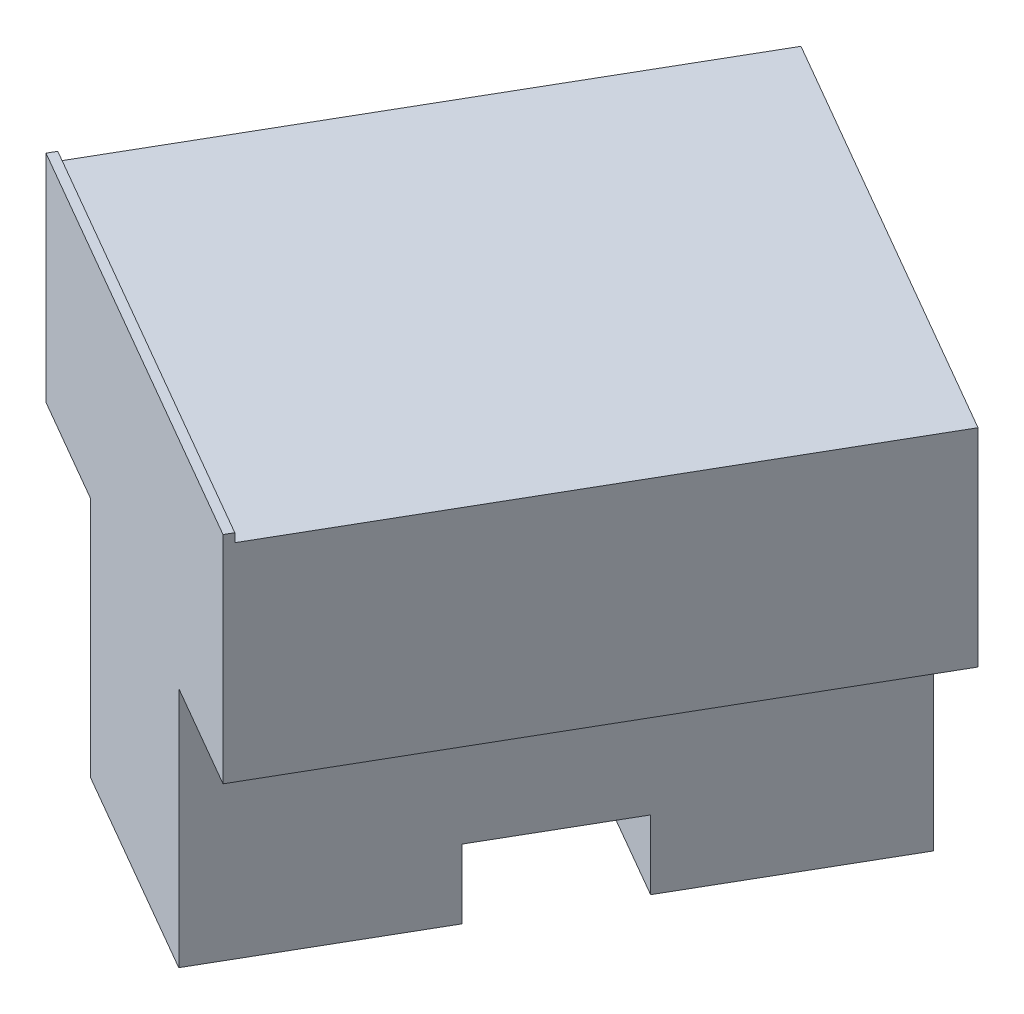
ISO-10303-21;
HEADER;
FILE_DESCRIPTION(('STEP AP214'),'2;1');
FILE_NAME('part.step','',(''),(''),'','','');
FILE_SCHEMA(('AUTOMOTIVE_DESIGN { 1 0 10303 214 1 1 1 1 }'));
ENDSEC;
DATA;
#1=APPLICATION_CONTEXT('core data for automotive mechanical design processes');
#2=APPLICATION_PROTOCOL_DEFINITION('international standard','automotive_design',2000,#1);
#3=PRODUCT_CONTEXT('',#1,'mechanical');
#4=PRODUCT('Part','Part','',(#3));
#5=PRODUCT_RELATED_PRODUCT_CATEGORY('part','',(#4));
#6=PRODUCT_DEFINITION_FORMATION('','',#4);
#7=PRODUCT_DEFINITION_CONTEXT('part definition',#1,'design');
#8=PRODUCT_DEFINITION('design','',#6,#7);
#9=PRODUCT_DEFINITION_SHAPE('','',#8);
#10=(LENGTH_UNIT() NAMED_UNIT(*) SI_UNIT(.MILLI.,.METRE.));
#11=(NAMED_UNIT(*) PLANE_ANGLE_UNIT() SI_UNIT($,.RADIAN.));
#12=(NAMED_UNIT(*) SI_UNIT($,.STERADIAN.) SOLID_ANGLE_UNIT());
#13=UNCERTAINTY_MEASURE_WITH_UNIT(LENGTH_MEASURE(1.E-05),#10,'distance_accuracy_value','');
#14=(GEOMETRIC_REPRESENTATION_CONTEXT(3) GLOBAL_UNCERTAINTY_ASSIGNED_CONTEXT((#13)) GLOBAL_UNIT_ASSIGNED_CONTEXT((#10,
#11,#12)) REPRESENTATION_CONTEXT('',''));
#15=CARTESIAN_POINT('',(0.,0.,0.));
#16=DIRECTION('',(0.,0.,1.));
#17=DIRECTION('',(1.,0.,0.));
#18=AXIS2_PLACEMENT_3D('',#15,#16,#17);
#19=CARTESIAN_POINT('',(13.75,-69.9999999999932,-23.8156986040721));
#20=DIRECTION('',(0.,-1.,0.));
#21=DIRECTION('',(0.,0.,-1.));
#22=AXIS2_PLACEMENT_3D('',#19,#20,#21);
#23=CONICAL_SURFACE('',#22,2.45849999999395,1.0471975511902);
#24=CARTESIAN_POINT('',(13.75,-68.5805843631897,-23.8156986040721));
#25=VERTEX_POINT('',#24);
#26=VERTEX_LOOP('',#25);
#27=FACE_BOUND('',#26,.T.);
#28=CARTESIAN_POINT('',(13.75,-70.,-23.8156986040721));
#29=DIRECTION('',(0.,-1.,0.));
#30=DIRECTION('',(0.,0.,-1.));
#31=AXIS2_PLACEMENT_3D('',#28,#29,#30);
#32=CIRCLE('',#31,2.4585);
#33=CARTESIAN_POINT('',(13.75,-70.,-26.2741986040721));
#34=VERTEX_POINT('',#33);
#35=EDGE_CURVE('E126',#34,#34,#32,.T.);
#36=ORIENTED_EDGE('',*,*,#35,.T.);
#37=EDGE_LOOP('',(#36));
#38=FACE_BOUND('',#37,.T.);
#39=ADVANCED_FACE('F17',(#27,#38),#23,.F.);
#40=CARTESIAN_POINT('',(23.75,-70.00000000005,-41.1362066797608));
#41=DIRECTION('',(0.,-1.,0.));
#42=DIRECTION('',(0.,0.,-1.));
#43=AXIS2_PLACEMENT_3D('',#40,#41,#42);
#44=CONICAL_SURFACE('',#43,2.45850000004293,1.04719755119505);
#45=CARTESIAN_POINT('',(23.75,-68.5805843632465,-41.1362066797608));
#46=VERTEX_POINT('',#45);
#47=VERTEX_LOOP('',#46);
#48=FACE_BOUND('',#47,.T.);
#49=CARTESIAN_POINT('',(23.75,-70.,-41.1362066797608));
#50=DIRECTION('',(0.,-1.,0.));
#51=DIRECTION('',(0.,0.,-1.));
#52=AXIS2_PLACEMENT_3D('',#49,#50,#51);
#53=CIRCLE('',#52,2.4585);
#54=CARTESIAN_POINT('',(23.75,-70.,-43.5947066797608));
#55=VERTEX_POINT('',#54);
#56=EDGE_CURVE('E128',#55,#55,#53,.T.);
#57=ORIENTED_EDGE('',*,*,#56,.T.);
#58=EDGE_LOOP('',(#57));
#59=FACE_BOUND('',#58,.T.);
#60=ADVANCED_FACE('F123',(#48,#59),#44,.F.);
#61=CARTESIAN_POINT('',(13.75,-75.72925,-23.8156986040721));
#62=DIRECTION('',(0.,-1.,0.));
#63=DIRECTION('',(0.,0.,-1.));
#64=AXIS2_PLACEMENT_3D('',#61,#62,#63);
#65=CYLINDRICAL_SURFACE('',#64,2.4585);
#66=CARTESIAN_POINT('',(13.75,-81.4584999999966,-23.8156986040721));
#67=DIRECTION('',(0.,-1.,0.));
#68=DIRECTION('',(-0.500000000001153,0.,0.866025403783773));
#69=AXIS2_PLACEMENT_3D('',#66,#67,#68);
#70=CIRCLE('',#69,2.45850000000816);
#71=CARTESIAN_POINT('',(12.5207499999931,-81.4584999999966,-21.6865751488626));
#72=VERTEX_POINT('',#71);
#73=EDGE_CURVE('E131',#72,#72,#70,.T.);
#74=ORIENTED_EDGE('',*,*,#73,.T.);
#75=EDGE_LOOP('',(#74));
#76=FACE_BOUND('',#75,.T.);
#77=ORIENTED_EDGE('',*,*,#35,.F.);
#78=EDGE_LOOP('',(#77));
#79=FACE_BOUND('',#78,.T.);
#80=ADVANCED_FACE('F175',(#76,#79),#65,.F.);
#81=CARTESIAN_POINT('',(23.75,-75.72925,-41.1362066797608));
#82=DIRECTION('',(0.,-1.,0.));
#83=DIRECTION('',(0.,0.,-1.));
#84=AXIS2_PLACEMENT_3D('',#81,#82,#83);
#85=CYLINDRICAL_SURFACE('',#84,2.4585);
#86=CARTESIAN_POINT('',(23.75,-81.4584999999966,-41.1362066797608));
#87=DIRECTION('',(0.,-1.,0.));
#88=DIRECTION('',(-0.499999999992,0.,0.866025403789057));
#89=AXIS2_PLACEMENT_3D('',#86,#87,#88);
#90=CIRCLE('',#89,2.45850000001451);
#91=CARTESIAN_POINT('',(22.5207500000124,-81.4584999999966,-39.0070832245328));
#92=VERTEX_POINT('',#91);
#93=EDGE_CURVE('E170',#92,#92,#90,.T.);
#94=ORIENTED_EDGE('',*,*,#93,.T.);
#95=EDGE_LOOP('',(#94));
#96=FACE_BOUND('',#95,.T.);
#97=ORIENTED_EDGE('',*,*,#56,.F.);
#98=EDGE_LOOP('',(#97));
#99=FACE_BOUND('',#98,.T.);
#100=ADVANCED_FACE('F180',(#96,#99),#85,.F.);
#101=CARTESIAN_POINT('',(13.75,-81.99999999988,-23.8156986040721));
#102=DIRECTION('',(0.,-1.,0.));
#103=DIRECTION('',(0.,0.,-1.));
#104=AXIS2_PLACEMENT_3D('',#101,#102,#103);
#105=CONICAL_SURFACE('',#104,2.99999999993318,0.785398163389481);
#106=CARTESIAN_POINT('',(13.75,-81.9999999999936,-23.8156986040721));
#107=DIRECTION('',(0.,-1.,0.));
#108=DIRECTION('',(0.,0.,-1.));
#109=AXIS2_PLACEMENT_3D('',#106,#107,#108);
#110=CIRCLE('',#109,3.00000000004686);
#111=CARTESIAN_POINT('',(13.75,-81.9999999999936,-26.815698604119));
#112=VERTEX_POINT('',#111);
#113=EDGE_CURVE('E20',#112,#112,#110,.F.);
#114=ORIENTED_EDGE('',*,*,#113,.F.);
#115=EDGE_LOOP('',(#114));
#116=FACE_BOUND('',#115,.T.);
#117=ORIENTED_EDGE('',*,*,#73,.F.);
#118=EDGE_LOOP('',(#117));
#119=FACE_BOUND('',#118,.T.);
#120=ADVANCED_FACE('F177',(#116,#119),#105,.F.);
#121=CARTESIAN_POINT('',(23.75,-81.9999999999936,-41.1362066797608));
#122=DIRECTION('',(0.,-1.,0.));
#123=DIRECTION('',(0.,0.,-1.));
#124=AXIS2_PLACEMENT_3D('',#121,#122,#123);
#125=CONICAL_SURFACE('',#124,3.00000000000297,0.785398163383392);
#126=CARTESIAN_POINT('',(23.75,-81.9999999999936,-41.1362066797608));
#127=DIRECTION('',(0.,-1.,0.));
#128=DIRECTION('',(0.,0.,-1.));
#129=AXIS2_PLACEMENT_3D('',#126,#127,#128);
#130=CIRCLE('',#129,3.00000000000297);
#131=CARTESIAN_POINT('',(23.75,-81.9999999999936,-44.1362066797638));
#132=VERTEX_POINT('',#131);
#133=EDGE_CURVE('E134',#132,#132,#130,.F.);
#134=ORIENTED_EDGE('',*,*,#133,.F.);
#135=EDGE_LOOP('',(#134));
#136=FACE_BOUND('',#135,.T.);
#137=ORIENTED_EDGE('',*,*,#93,.F.);
#138=EDGE_LOOP('',(#137));
#139=FACE_BOUND('',#138,.T.);
#140=ADVANCED_FACE('F179',(#136,#139),#125,.F.);
#141=CARTESIAN_POINT('',(14.6878221735089,-82.,-39.4400542570542));
#142=DIRECTION('',(0.5,0.,-0.866025403784439));
#143=DIRECTION('',(-0.866025403784439,0.,-0.5));
#144=AXIS2_PLACEMENT_3D('',#141,#142,#143);
#145=PLANE('',#144);
#146=DIRECTION('',(0.,1.,0.));
#147=VECTOR('',#146,1.);
#148=CARTESIAN_POINT('',(14.6878221735089,-68.,-39.4400542570542));
#149=LINE('',#148,#147);
#150=CARTESIAN_POINT('',(14.6878221735089,-82.,-39.4400542570542));
#151=VERTEX_POINT('',#150);
#152=CARTESIAN_POINT('',(14.6878221735089,-78.,-39.4400542570542));
#153=VERTEX_POINT('',#152);
#154=EDGE_CURVE('E156',#151,#153,#149,.T.);
#155=ORIENTED_EDGE('',*,*,#154,.F.);
#156=DIRECTION('',(-0.86602540378444,0.,-0.5));
#157=VECTOR('',#156,1.);
#158=CARTESIAN_POINT('',(26.8121778264911,-82.,-32.4400542570542));
#159=LINE('',#158,#157);
#160=CARTESIAN_POINT('',(26.8121778264911,-82.,-32.4400542570542));
#161=VERTEX_POINT('',#160);
#162=EDGE_CURVE('E136',#161,#151,#159,.T.);
#163=ORIENTED_EDGE('',*,*,#162,.F.);
#164=DIRECTION('',(0.,1.,0.));
#165=VECTOR('',#164,1.);
#166=CARTESIAN_POINT('',(26.8121778264911,-82.,-32.4400542570542));
#167=LINE('',#166,#165);
#168=CARTESIAN_POINT('',(26.8121778264911,-78.,-32.4400542570542));
#169=VERTEX_POINT('',#168);
#170=EDGE_CURVE('E270',#169,#161,#167,.F.);
#171=ORIENTED_EDGE('',*,*,#170,.F.);
#172=DIRECTION('',(0.86602540378444,0.,0.5));
#173=VECTOR('',#172,1.);
#174=CARTESIAN_POINT('',(14.6878221735089,-78.,-39.4400542570542));
#175=LINE('',#174,#173);
#176=EDGE_CURVE('E165',#153,#169,#175,.T.);
#177=ORIENTED_EDGE('',*,*,#176,.F.);
#178=EDGE_LOOP('',(#155,#163,#171,#177));
#179=FACE_BOUND('',#178,.T.);
#180=ADVANCED_FACE('F189',(#179),#145,.F.);
#181=CARTESIAN_POINT('',(22.8121778264911,-82.,-25.5118510267787));
#182=DIRECTION('',(-0.5,0.,0.866025403784439));
#183=DIRECTION('',(0.866025403784439,0.,0.5));
#184=AXIS2_PLACEMENT_3D('',#181,#182,#183);
#185=PLANE('',#184);
#186=DIRECTION('',(0.,1.,0.));
#187=VECTOR('',#186,1.);
#188=CARTESIAN_POINT('',(22.8121778264911,-82.,-25.5118510267787));
#189=LINE('',#188,#187);
#190=CARTESIAN_POINT('',(22.8121778264911,-82.,-25.5118510267787));
#191=VERTEX_POINT('',#190);
#192=CARTESIAN_POINT('',(22.8121778264911,-78.,-25.5118510267787));
#193=VERTEX_POINT('',#192);
#194=EDGE_CURVE('E286',#191,#193,#189,.T.);
#195=ORIENTED_EDGE('',*,*,#194,.F.);
#196=DIRECTION('',(0.86602540378444,0.,0.5));
#197=VECTOR('',#196,1.);
#198=CARTESIAN_POINT('',(10.6878221735089,-82.,-32.5118510267787));
#199=LINE('',#198,#197);
#200=CARTESIAN_POINT('',(10.6878221735089,-82.,-32.5118510267787));
#201=VERTEX_POINT('',#200);
#202=EDGE_CURVE('E163',#201,#191,#199,.T.);
#203=ORIENTED_EDGE('',*,*,#202,.F.);
#204=DIRECTION('',(0.,1.,0.));
#205=VECTOR('',#204,1.);
#206=CARTESIAN_POINT('',(10.6878221735089,-68.,-32.5118510267787));
#207=LINE('',#206,#205);
#208=CARTESIAN_POINT('',(10.6878221735089,-78.,-32.5118510267787));
#209=VERTEX_POINT('',#208);
#210=EDGE_CURVE('E143',#209,#201,#207,.F.);
#211=ORIENTED_EDGE('',*,*,#210,.F.);
#212=DIRECTION('',(-0.86602540378444,0.,-0.5));
#213=VECTOR('',#212,1.);
#214=CARTESIAN_POINT('',(22.8121778264911,-78.,-25.5118510267787));
#215=LINE('',#214,#213);
#216=EDGE_CURVE('E168',#193,#209,#215,.T.);
#217=ORIENTED_EDGE('',*,*,#216,.F.);
#218=EDGE_LOOP('',(#195,#203,#211,#217));
#219=FACE_BOUND('',#218,.T.);
#220=ADVANCED_FACE('F253',(#219),#185,.F.);
#221=CARTESIAN_POINT('',(32.8121778264911,-78.,-42.8323591024675));
#222=DIRECTION('',(0.,-1.,0.));
#223=DIRECTION('',(0.,0.,-1.));
#224=AXIS2_PLACEMENT_3D('',#221,#222,#223);
#225=PLANE('',#224);
#226=ORIENTED_EDGE('',*,*,#176,.T.);
#227=DIRECTION('',(0.5,0.,-0.866025403784439));
#228=VECTOR('',#227,1.);
#229=CARTESIAN_POINT('',(16.8121778264911,-78.,-15.1195461813654));
#230=LINE('',#229,#228);
#231=EDGE_CURVE('E281',#193,#169,#230,.T.);
#232=ORIENTED_EDGE('',*,*,#231,.F.);
#233=ORIENTED_EDGE('',*,*,#216,.T.);
#234=DIRECTION('',(-0.5,0.,0.866025403784439));
#235=VECTOR('',#234,1.);
#236=CARTESIAN_POINT('',(4.68782217350893,-78.,-22.1195461813654));
#237=LINE('',#236,#235);
#238=EDGE_CURVE('E150',#153,#209,#237,.T.);
#239=ORIENTED_EDGE('',*,*,#238,.F.);
#240=EDGE_LOOP('',(#226,#232,#233,#239));
#241=FACE_BOUND('',#240,.T.);
#242=ADVANCED_FACE('F249',(#241),#225,.T.);
#243=CARTESIAN_POINT('',(4.68782217350893,-82.,-22.1195461813654));
#244=DIRECTION('',(0.,-1.,0.));
#245=DIRECTION('',(0.,0.,-1.));
#246=AXIS2_PLACEMENT_3D('',#243,#244,#245);
#247=PLANE('',#246);
#248=DIRECTION('',(0.866025403784439,0.,0.5));
#249=VECTOR('',#248,1.);
#250=CARTESIAN_POINT('',(10.75,-82.,-18.6195461813654));
#251=LINE('',#250,#249);
#252=CARTESIAN_POINT('',(4.68782217350893,-82.,-22.1195461813654));
#253=VERTEX_POINT('',#252);
#254=CARTESIAN_POINT('',(16.8121778264911,-82.,-15.1195461813654));
#255=VERTEX_POINT('',#254);
#256=EDGE_CURVE('E300',#253,#255,#251,.T.);
#257=ORIENTED_EDGE('',*,*,#256,.F.);
#258=DIRECTION('',(-0.5,0.,0.866025403784439));
#259=VECTOR('',#258,1.);
#260=CARTESIAN_POINT('',(4.68782217350893,-82.,-22.1195461813654));
#261=LINE('',#260,#259);
#262=EDGE_CURVE('E137',#201,#253,#261,.T.);
#263=ORIENTED_EDGE('',*,*,#262,.F.);
#264=ORIENTED_EDGE('',*,*,#202,.T.);
#265=DIRECTION('',(0.5,0.,-0.866025403784439));
#266=VECTOR('',#265,1.);
#267=CARTESIAN_POINT('',(16.8121778264911,-82.,-15.1195461813654));
#268=LINE('',#267,#266);
#269=EDGE_CURVE('E276',#255,#191,#268,.T.);
#270=ORIENTED_EDGE('',*,*,#269,.F.);
#271=EDGE_LOOP('',(#257,#263,#264,#270));
#272=FACE_BOUND('',#271,.T.);
#273=ORIENTED_EDGE('',*,*,#113,.T.);
#274=EDGE_LOOP('',(#273));
#275=FACE_BOUND('',#274,.T.);
#276=ADVANCED_FACE('F245',(#272,#275),#247,.T.);
#277=CARTESIAN_POINT('',(22.8743556529821,-55.5,-11.6195461813654));
#278=DIRECTION('',(0.,1.,0.));
#279=DIRECTION('',(0.,0.,1.));
#280=AXIS2_PLACEMENT_3D('',#277,#278,#279);
#281=PLANE('',#280);
#282=DIRECTION('',(0.866025403784439,0.,0.5));
#283=VECTOR('',#282,1.);
#284=CARTESIAN_POINT('',(10.75,-55.5,-18.6195461813654));
#285=LINE('',#284,#283);
#286=CARTESIAN_POINT('',(22.8743556529821,-55.5,-11.6195461813654));
#287=VERTEX_POINT('',#286);
#288=CARTESIAN_POINT('',(-1.37435565298214,-55.5,-25.6195461813654));
#289=VERTEX_POINT('',#288);
#290=EDGE_CURVE('E308',#287,#289,#285,.F.);
#291=ORIENTED_EDGE('',*,*,#290,.F.);
#292=DIRECTION('',(0.499999999999932,0.,-0.866025403784478));
#293=VECTOR('',#292,1.);
#294=CARTESIAN_POINT('',(22.8743556529821,-55.5,-11.6195461813654));
#295=LINE('',#294,#293);
#296=CARTESIAN_POINT('',(23.1243556529821,-55.5,-12.0525588832577));
#297=VERTEX_POINT('',#296);
#298=EDGE_CURVE('E159',#287,#297,#295,.T.);
#299=ORIENTED_EDGE('',*,*,#298,.T.);
#300=DIRECTION('',(0.866025403784439,0.,0.5));
#301=VECTOR('',#300,1.);
#302=CARTESIAN_POINT('',(11.,-55.5,-19.0525588832577));
#303=LINE('',#302,#301);
#304=CARTESIAN_POINT('',(-1.12435565298213,-55.5,-26.0525588832577));
#305=VERTEX_POINT('',#304);
#306=EDGE_CURVE('E311',#297,#305,#303,.F.);
#307=ORIENTED_EDGE('',*,*,#306,.T.);
#308=DIRECTION('',(-0.499999999999932,0.,0.866025403784478));
#309=VECTOR('',#308,1.);
#310=CARTESIAN_POINT('',(-1.12435565298214,-55.5,-26.0525588832577));
#311=LINE('',#310,#309);
#312=EDGE_CURVE('E161',#305,#289,#311,.T.);
#313=ORIENTED_EDGE('',*,*,#312,.T.);
#314=EDGE_LOOP('',(#291,#299,#307,#313));
#315=FACE_BOUND('',#314,.T.);
#316=ADVANCED_FACE('F242',(#315),#281,.T.);
#317=CARTESIAN_POINT('',(4.68782217350893,-68.,-22.1195461813654));
#318=DIRECTION('',(-0.866025403784439,0.,-0.5));
#319=DIRECTION('',(-0.5,0.,0.866025403784439));
#320=AXIS2_PLACEMENT_3D('',#317,#318,#319);
#321=PLANE('',#320);
#322=DIRECTION('',(0.,1.,0.));
#323=VECTOR('',#322,1.);
#324=CARTESIAN_POINT('',(20.6878221735089,-56.,-49.8323591024675));
#325=LINE('',#324,#323);
#326=CARTESIAN_POINT('',(20.6878221735089,-68.,-49.8323591024675));
#327=VERTEX_POINT('',#326);
#328=CARTESIAN_POINT('',(20.687822173509,-82.,-49.8323591024675));
#329=VERTEX_POINT('',#328);
#330=EDGE_CURVE('E268',#327,#329,#325,.F.);
#331=ORIENTED_EDGE('',*,*,#330,.T.);
#332=DIRECTION('',(0.5,0.,-0.866025403784439));
#333=VECTOR('',#332,1.);
#334=CARTESIAN_POINT('',(14.6878221735089,-82.,-39.4400542570542));
#335=LINE('',#334,#333);
#336=EDGE_CURVE('E141',#151,#329,#335,.T.);
#337=ORIENTED_EDGE('',*,*,#336,.F.);
#338=ORIENTED_EDGE('',*,*,#154,.T.);
#339=ORIENTED_EDGE('',*,*,#238,.T.);
#340=ORIENTED_EDGE('',*,*,#210,.T.);
#341=ORIENTED_EDGE('',*,*,#262,.T.);
#342=DIRECTION('',(0.,1.,0.));
#343=VECTOR('',#342,1.);
#344=CARTESIAN_POINT('',(4.68782217350893,-56.,-22.1195461813654));
#345=LINE('',#344,#343);
#346=CARTESIAN_POINT('',(4.68782217350893,-68.,-22.1195461813654));
#347=VERTEX_POINT('',#346);
#348=EDGE_CURVE('E297',#347,#253,#345,.F.);
#349=ORIENTED_EDGE('',*,*,#348,.F.);
#350=DIRECTION('',(-0.5,0.,0.86602540378444));
#351=VECTOR('',#350,1.);
#352=CARTESIAN_POINT('',(20.6878221735089,-68.,-49.8323591024675));
#353=LINE('',#352,#351);
#354=EDGE_CURVE('E292',#327,#347,#353,.T.);
#355=ORIENTED_EDGE('',*,*,#354,.F.);
#356=EDGE_LOOP('',(#331,#337,#338,#339,#340,#341,#349,#355));
#357=FACE_BOUND('',#356,.T.);
#358=ADVANCED_FACE('F238',(#357),#321,.T.);
#359=CARTESIAN_POINT('',(4.68782217350893,-82.,-22.1195461813654));
#360=DIRECTION('',(0.,-1.,0.));
#361=DIRECTION('',(0.,0.,-1.));
#362=AXIS2_PLACEMENT_3D('',#359,#360,#361);
#363=PLANE('',#362);
#364=DIRECTION('',(0.866025403784439,0.,0.5));
#365=VECTOR('',#364,1.);
#366=CARTESIAN_POINT('',(26.75,-82.,-46.3323591024675));
#367=LINE('',#366,#365);
#368=CARTESIAN_POINT('',(32.8121778264911,-82.,-42.8323591024675));
#369=VERTEX_POINT('',#368);
#370=EDGE_CURVE('E274',#329,#369,#367,.T.);
#371=ORIENTED_EDGE('',*,*,#370,.T.);
#372=DIRECTION('',(0.5,0.,-0.866025403784439));
#373=VECTOR('',#372,1.);
#374=CARTESIAN_POINT('',(16.8121778264911,-82.,-15.1195461813654));
#375=LINE('',#374,#373);
#376=EDGE_CURVE('E272',#161,#369,#375,.T.);
#377=ORIENTED_EDGE('',*,*,#376,.F.);
#378=ORIENTED_EDGE('',*,*,#162,.T.);
#379=ORIENTED_EDGE('',*,*,#336,.T.);
#380=EDGE_LOOP('',(#371,#377,#378,#379));
#381=FACE_BOUND('',#380,.T.);
#382=ORIENTED_EDGE('',*,*,#133,.T.);
#383=EDGE_LOOP('',(#382));
#384=FACE_BOUND('',#383,.T.);
#385=ADVANCED_FACE('F234',(#381,#384),#363,.T.);
#386=CARTESIAN_POINT('',(16.8121778264911,-82.,-15.1195461813654));
#387=DIRECTION('',(0.866025403784439,0.,0.5));
#388=DIRECTION('',(0.5,0.,-0.866025403784439));
#389=AXIS2_PLACEMENT_3D('',#386,#387,#388);
#390=PLANE('',#389);
#391=ORIENTED_EDGE('',*,*,#194,.T.);
#392=ORIENTED_EDGE('',*,*,#231,.T.);
#393=ORIENTED_EDGE('',*,*,#170,.T.);
#394=ORIENTED_EDGE('',*,*,#376,.T.);
#395=DIRECTION('',(0.,1.,0.));
#396=VECTOR('',#395,1.);
#397=CARTESIAN_POINT('',(32.8121778264911,-56.,-42.8323591024675));
#398=LINE('',#397,#396);
#399=CARTESIAN_POINT('',(32.8121778264911,-68.,-42.8323591024675));
#400=VERTEX_POINT('',#399);
#401=EDGE_CURVE('E325',#369,#400,#398,.T.);
#402=ORIENTED_EDGE('',*,*,#401,.T.);
#403=DIRECTION('',(0.5,0.,-0.866025403784439));
#404=VECTOR('',#403,1.);
#405=CARTESIAN_POINT('',(16.8121778264911,-68.,-15.1195461813654));
#406=LINE('',#405,#404);
#407=CARTESIAN_POINT('',(16.8121778264911,-68.,-15.1195461813654));
#408=VERTEX_POINT('',#407);
#409=EDGE_CURVE('E289',#408,#400,#406,.T.);
#410=ORIENTED_EDGE('',*,*,#409,.F.);
#411=DIRECTION('',(0.,1.,0.));
#412=VECTOR('',#411,1.);
#413=CARTESIAN_POINT('',(16.8121778264911,-56.,-15.1195461813654));
#414=LINE('',#413,#412);
#415=EDGE_CURVE('E303',#255,#408,#414,.T.);
#416=ORIENTED_EDGE('',*,*,#415,.F.);
#417=ORIENTED_EDGE('',*,*,#269,.T.);
#418=EDGE_LOOP('',(#391,#392,#393,#394,#402,#410,#416,#417));
#419=FACE_BOUND('',#418,.T.);
#420=ADVANCED_FACE('F230',(#419),#390,.T.);
#421=CARTESIAN_POINT('',(16.8121778264911,-68.,-15.1195461813654));
#422=DIRECTION('',(0.,-1.,0.));
#423=DIRECTION('',(0.,0.,-1.));
#424=AXIS2_PLACEMENT_3D('',#421,#422,#423);
#425=PLANE('',#424);
#426=DIRECTION('',(0.866025403784439,0.,0.5));
#427=VECTOR('',#426,1.);
#428=CARTESIAN_POINT('',(10.75,-68.,-18.6195461813654));
#429=LINE('',#428,#427);
#430=CARTESIAN_POINT('',(22.8743556529821,-68.,-11.6195461813654));
#431=VERTEX_POINT('',#430);
#432=EDGE_CURVE('E306',#408,#431,#429,.T.);
#433=ORIENTED_EDGE('',*,*,#432,.F.);
#434=ORIENTED_EDGE('',*,*,#409,.T.);
#435=DIRECTION('',(0.866025403784439,0.,0.5));
#436=VECTOR('',#435,1.);
#437=CARTESIAN_POINT('',(26.75,-68.,-46.3323591024675));
#438=LINE('',#437,#436);
#439=CARTESIAN_POINT('',(38.8743556529821,-68.,-39.3323591024675));
#440=VERTEX_POINT('',#439);
#441=EDGE_CURVE('E327',#400,#440,#438,.T.);
#442=ORIENTED_EDGE('',*,*,#441,.T.);
#443=DIRECTION('',(0.5,0.,-0.866025403784439));
#444=VECTOR('',#443,1.);
#445=CARTESIAN_POINT('',(22.8743556529821,-68.,-11.6195461813654));
#446=LINE('',#445,#444);
#447=EDGE_CURVE('E320',#431,#440,#446,.T.);
#448=ORIENTED_EDGE('',*,*,#447,.F.);
#449=EDGE_LOOP('',(#433,#434,#442,#448));
#450=FACE_BOUND('',#449,.T.);
#451=ADVANCED_FACE('F226',(#450),#425,.T.);
#452=CARTESIAN_POINT('',(-1.37435565298214,-68.,-25.6195461813654));
#453=DIRECTION('',(0.,-1.,0.));
#454=DIRECTION('',(0.,0.,-1.));
#455=AXIS2_PLACEMENT_3D('',#452,#453,#454);
#456=PLANE('',#455);
#457=DIRECTION('',(0.866025403784439,0.,0.5));
#458=VECTOR('',#457,1.);
#459=CARTESIAN_POINT('',(10.75,-68.,-18.6195461813654));
#460=LINE('',#459,#458);
#461=CARTESIAN_POINT('',(-1.37435565298214,-68.,-25.6195461813654));
#462=VERTEX_POINT('',#461);
#463=EDGE_CURVE('E294',#462,#347,#460,.T.);
#464=ORIENTED_EDGE('',*,*,#463,.F.);
#465=DIRECTION('',(-0.5,0.,0.866025403784439));
#466=VECTOR('',#465,1.);
#467=CARTESIAN_POINT('',(-1.37435565298214,-68.,-25.6195461813654));
#468=LINE('',#467,#466);
#469=CARTESIAN_POINT('',(14.6256443470179,-68.,-53.3323591024675));
#470=VERTEX_POINT('',#469);
#471=EDGE_CURVE('E335',#470,#462,#468,.T.);
#472=ORIENTED_EDGE('',*,*,#471,.F.);
#473=DIRECTION('',(0.866025403784439,0.,0.5));
#474=VECTOR('',#473,1.);
#475=CARTESIAN_POINT('',(26.75,-68.,-46.3323591024675));
#476=LINE('',#475,#474);
#477=EDGE_CURVE('E331',#470,#327,#476,.T.);
#478=ORIENTED_EDGE('',*,*,#477,.T.);
#479=ORIENTED_EDGE('',*,*,#354,.T.);
#480=EDGE_LOOP('',(#464,#472,#478,#479));
#481=FACE_BOUND('',#480,.T.);
#482=ADVANCED_FACE('F222',(#481),#456,.T.);
#483=CARTESIAN_POINT('',(10.75,-56.,-18.6195461813654));
#484=DIRECTION('',(-0.5,0.,0.866025403784439));
#485=DIRECTION('',(0.866025403784439,0.,0.5));
#486=AXIS2_PLACEMENT_3D('',#483,#484,#485);
#487=PLANE('',#486);
#488=DIRECTION('',(0.,1.,0.));
#489=VECTOR('',#488,1.);
#490=CARTESIAN_POINT('',(22.8743556529821,-68.,-11.6195461813654));
#491=LINE('',#490,#489);
#492=EDGE_CURVE('E317',#287,#431,#491,.F.);
#493=ORIENTED_EDGE('',*,*,#492,.F.);
#494=ORIENTED_EDGE('',*,*,#290,.T.);
#495=DIRECTION('',(0.,1.,0.));
#496=VECTOR('',#495,1.);
#497=CARTESIAN_POINT('',(-1.37435565298214,-56.,-25.6195461813654));
#498=LINE('',#497,#496);
#499=EDGE_CURVE('E338',#462,#289,#498,.T.);
#500=ORIENTED_EDGE('',*,*,#499,.F.);
#501=ORIENTED_EDGE('',*,*,#463,.T.);
#502=ORIENTED_EDGE('',*,*,#348,.T.);
#503=ORIENTED_EDGE('',*,*,#256,.T.);
#504=ORIENTED_EDGE('',*,*,#415,.T.);
#505=ORIENTED_EDGE('',*,*,#432,.T.);
#506=EDGE_LOOP('',(#493,#494,#500,#501,#502,#503,#504,#505));
#507=FACE_BOUND('',#506,.T.);
#508=ADVANCED_FACE('F218',(#507),#487,.T.);
#509=CARTESIAN_POINT('',(11.,-56.,-19.0525588832577));
#510=DIRECTION('',(-0.5,0.,0.866025403784439));
#511=DIRECTION('',(0.866025403784439,0.,0.5));
#512=AXIS2_PLACEMENT_3D('',#509,#510,#511);
#513=PLANE('',#512);
#514=DIRECTION('',(0.866025403784438,0.,0.5));
#515=VECTOR('',#514,1.);
#516=CARTESIAN_POINT('',(-1.12435565298214,-56.,-26.0525588832577));
#517=LINE('',#516,#515);
#518=CARTESIAN_POINT('',(-1.12435565298213,-56.,-26.0525588832577));
#519=VERTEX_POINT('',#518);
#520=CARTESIAN_POINT('',(23.1243556529821,-56.,-12.0525588832577));
#521=VERTEX_POINT('',#520);
#522=EDGE_CURVE('E344',#519,#521,#517,.T.);
#523=ORIENTED_EDGE('',*,*,#522,.F.);
#524=DIRECTION('',(0.,1.,0.));
#525=VECTOR('',#524,1.);
#526=CARTESIAN_POINT('',(-1.12435565298211,-56.,-26.0525588832577));
#527=LINE('',#526,#525);
#528=EDGE_CURVE('E341',#305,#519,#527,.F.);
#529=ORIENTED_EDGE('',*,*,#528,.F.);
#530=ORIENTED_EDGE('',*,*,#306,.F.);
#531=DIRECTION('',(0.,1.,0.));
#532=VECTOR('',#531,1.);
#533=CARTESIAN_POINT('',(23.1243556529821,-68.,-12.0525588832577));
#534=LINE('',#533,#532);
#535=EDGE_CURVE('E314',#521,#297,#534,.T.);
#536=ORIENTED_EDGE('',*,*,#535,.F.);
#537=EDGE_LOOP('',(#523,#529,#530,#536));
#538=FACE_BOUND('',#537,.T.);
#539=ADVANCED_FACE('F214',(#538),#513,.F.);
#540=CARTESIAN_POINT('',(22.8743556529821,-68.,-11.6195461813654));
#541=DIRECTION('',(0.866025403784439,0.,0.5));
#542=DIRECTION('',(0.5,0.,-0.866025403784439));
#543=AXIS2_PLACEMENT_3D('',#540,#541,#542);
#544=PLANE('',#543);
#545=ORIENTED_EDGE('',*,*,#492,.T.);
#546=ORIENTED_EDGE('',*,*,#447,.T.);
#547=DIRECTION('',(0.,1.,0.));
#548=VECTOR('',#547,1.);
#549=CARTESIAN_POINT('',(38.8743556529821,-56.,-39.3323591024675));
#550=LINE('',#549,#548);
#551=CARTESIAN_POINT('',(38.8743556529821,-56.,-39.3323591024675));
#552=VERTEX_POINT('',#551);
#553=EDGE_CURVE('E329',#440,#552,#550,.T.);
#554=ORIENTED_EDGE('',*,*,#553,.T.);
#555=DIRECTION('',(0.5,0.,-0.866025403784438));
#556=VECTOR('',#555,1.);
#557=CARTESIAN_POINT('',(23.1243556529821,-56.,-12.0525588832577));
#558=LINE('',#557,#556);
#559=EDGE_CURVE('E347',#521,#552,#558,.T.);
#560=ORIENTED_EDGE('',*,*,#559,.F.);
#561=ORIENTED_EDGE('',*,*,#535,.T.);
#562=ORIENTED_EDGE('',*,*,#298,.F.);
#563=EDGE_LOOP('',(#545,#546,#554,#560,#561,#562));
#564=FACE_BOUND('',#563,.T.);
#565=ADVANCED_FACE('F211',(#564),#544,.T.);
#566=CARTESIAN_POINT('',(26.75,-56.,-46.3323591024675));
#567=DIRECTION('',(-0.5,0.,0.866025403784439));
#568=DIRECTION('',(0.866025403784439,0.,0.5));
#569=AXIS2_PLACEMENT_3D('',#566,#567,#568);
#570=PLANE('',#569);
#571=DIRECTION('',(0.,1.,0.));
#572=VECTOR('',#571,1.);
#573=CARTESIAN_POINT('',(14.6256443470179,-56.,-53.3323591024675));
#574=LINE('',#573,#572);
#575=CARTESIAN_POINT('',(14.6256443470179,-56.,-53.3323591024675));
#576=VERTEX_POINT('',#575);
#577=EDGE_CURVE('E35',#576,#470,#574,.F.);
#578=ORIENTED_EDGE('',*,*,#577,.F.);
#579=DIRECTION('',(-0.866025403784438,0.,-0.5));
#580=VECTOR('',#579,1.);
#581=CARTESIAN_POINT('',(38.8743556529821,-56.,-39.3323591024675));
#582=LINE('',#581,#580);
#583=EDGE_CURVE('E26',#552,#576,#582,.T.);
#584=ORIENTED_EDGE('',*,*,#583,.F.);
#585=ORIENTED_EDGE('',*,*,#553,.F.);
#586=ORIENTED_EDGE('',*,*,#441,.F.);
#587=ORIENTED_EDGE('',*,*,#401,.F.);
#588=ORIENTED_EDGE('',*,*,#370,.F.);
#589=ORIENTED_EDGE('',*,*,#330,.F.);
#590=ORIENTED_EDGE('',*,*,#477,.F.);
#591=EDGE_LOOP('',(#578,#584,#585,#586,#587,#588,#589,#590));
#592=FACE_BOUND('',#591,.T.);
#593=ADVANCED_FACE('F204',(#592),#570,.F.);
#594=CARTESIAN_POINT('',(-1.37435565298214,-56.,-25.6195461813654));
#595=DIRECTION('',(-0.866025403784439,0.,-0.5));
#596=DIRECTION('',(-0.5,0.,0.866025403784439));
#597=AXIS2_PLACEMENT_3D('',#594,#595,#596);
#598=PLANE('',#597);
#599=ORIENTED_EDGE('',*,*,#528,.T.);
#600=DIRECTION('',(-0.5,0.,0.866025403784438));
#601=VECTOR('',#600,1.);
#602=CARTESIAN_POINT('',(14.6256443470179,-56.,-53.3323591024675));
#603=LINE('',#602,#601);
#604=EDGE_CURVE('E11',#576,#519,#603,.T.);
#605=ORIENTED_EDGE('',*,*,#604,.F.);
#606=ORIENTED_EDGE('',*,*,#577,.T.);
#607=ORIENTED_EDGE('',*,*,#471,.T.);
#608=ORIENTED_EDGE('',*,*,#499,.T.);
#609=ORIENTED_EDGE('',*,*,#312,.F.);
#610=EDGE_LOOP('',(#599,#605,#606,#607,#608,#609));
#611=FACE_BOUND('',#610,.T.);
#612=ADVANCED_FACE('F197',(#611),#598,.T.);
#613=CARTESIAN_POINT('',(22.8743556529821,-56.,-11.6195461813654));
#614=DIRECTION('',(0.,1.,0.));
#615=DIRECTION('',(-1.,0.,0.));
#616=AXIS2_PLACEMENT_3D('',#613,#614,#615);
#617=PLANE('',#616);
#618=ORIENTED_EDGE('',*,*,#583,.T.);
#619=ORIENTED_EDGE('',*,*,#604,.T.);
#620=ORIENTED_EDGE('',*,*,#522,.T.);
#621=ORIENTED_EDGE('',*,*,#559,.T.);
#622=EDGE_LOOP('',(#618,#619,#620,#621));
#623=FACE_BOUND('',#622,.T.);
#624=ADVANCED_FACE('F195',(#623),#617,.T.);
#625=CLOSED_SHELL('',(#39,#60,#80,#100,#120,#140,#180,#220,#242,#276,#316,#358,#385,#420,#451,
#482,#508,#539,#565,#593,#612,#624));
#626=MANIFOLD_SOLID_BREP('B1',#625);
#627=ADVANCED_BREP_SHAPE_REPRESENTATION('',(#18,#626),#14);
#628=SHAPE_DEFINITION_REPRESENTATION(#9,#627);
ENDSEC;
END-ISO-10303-21;
